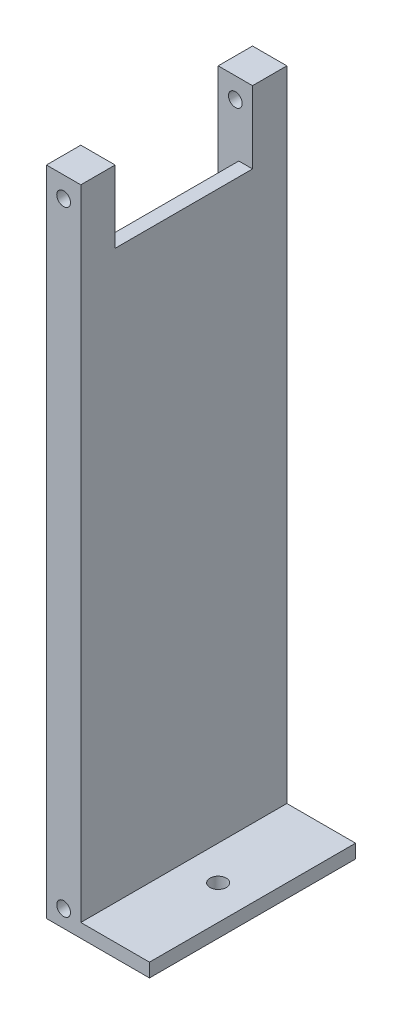
ISO-10303-21;
HEADER;
FILE_DESCRIPTION(('STEP AP214'),'2;1');
FILE_NAME('part.step','',(''),(''),'','','');
FILE_SCHEMA(('AUTOMOTIVE_DESIGN { 1 0 10303 214 1 1 1 1 }'));
ENDSEC;
DATA;
#1=APPLICATION_CONTEXT('core data for automotive mechanical design processes');
#2=APPLICATION_PROTOCOL_DEFINITION('international standard','automotive_design',2000,#1);
#3=PRODUCT_CONTEXT('',#1,'mechanical');
#4=PRODUCT('Part','Part','',(#3));
#5=PRODUCT_RELATED_PRODUCT_CATEGORY('part','',(#4));
#6=PRODUCT_DEFINITION_FORMATION('','',#4);
#7=PRODUCT_DEFINITION_CONTEXT('part definition',#1,'design');
#8=PRODUCT_DEFINITION('design','',#6,#7);
#9=PRODUCT_DEFINITION_SHAPE('','',#8);
#10=(LENGTH_UNIT() NAMED_UNIT(*) SI_UNIT(.MILLI.,.METRE.));
#11=(NAMED_UNIT(*) PLANE_ANGLE_UNIT() SI_UNIT($,.RADIAN.));
#12=(NAMED_UNIT(*) SI_UNIT($,.STERADIAN.) SOLID_ANGLE_UNIT());
#13=UNCERTAINTY_MEASURE_WITH_UNIT(LENGTH_MEASURE(1.E-05),#10,'distance_accuracy_value','');
#14=(GEOMETRIC_REPRESENTATION_CONTEXT(3) GLOBAL_UNCERTAINTY_ASSIGNED_CONTEXT((#13)) GLOBAL_UNIT_ASSIGNED_CONTEXT((#10,
#11,#12)) REPRESENTATION_CONTEXT('',''));
#15=CARTESIAN_POINT('',(0.,0.,0.));
#16=DIRECTION('',(0.,0.,1.));
#17=DIRECTION('',(1.,0.,0.));
#18=AXIS2_PLACEMENT_3D('',#15,#16,#17);
#19=CARTESIAN_POINT('',(5.,47.5,15.));
#20=DIRECTION('',(0.,-1.,0.));
#21=DIRECTION('',(0.,0.,-1.));
#22=AXIS2_PLACEMENT_3D('',#19,#20,#21);
#23=PLANE('',#22);
#24=DIRECTION('',(0.,0.,1.));
#25=VECTOR('',#24,1.);
#26=CARTESIAN_POINT('',(5.,47.5,15.));
#27=LINE('',#26,#25);
#28=CARTESIAN_POINT('',(5.,47.5,9.99999999999999));
#29=VERTEX_POINT('',#28);
#30=CARTESIAN_POINT('',(5.,47.5,15.));
#31=VERTEX_POINT('',#30);
#32=EDGE_CURVE('E222',#29,#31,#27,.T.);
#33=ORIENTED_EDGE('',*,*,#32,.F.);
#34=DIRECTION('',(-1.,0.,0.));
#35=VECTOR('',#34,1.);
#36=CARTESIAN_POINT('',(3.,47.5,9.99999999999999));
#37=LINE('',#36,#35);
#38=CARTESIAN_POINT('',(0.,47.5,9.99999999999999));
#39=VERTEX_POINT('',#38);
#40=EDGE_CURVE('E150',#29,#39,#37,.T.);
#41=ORIENTED_EDGE('',*,*,#40,.T.);
#42=DIRECTION('',(0.,0.,1.));
#43=VECTOR('',#42,1.);
#44=CARTESIAN_POINT('',(0.,47.5,15.));
#45=LINE('',#44,#43);
#46=CARTESIAN_POINT('',(0.,47.5,15.));
#47=VERTEX_POINT('',#46);
#48=EDGE_CURVE('E233',#39,#47,#45,.T.);
#49=ORIENTED_EDGE('',*,*,#48,.T.);
#50=DIRECTION('',(-1.,0.,0.));
#51=VECTOR('',#50,1.);
#52=CARTESIAN_POINT('',(5.,47.5,15.));
#53=LINE('',#52,#51);
#54=EDGE_CURVE('E209',#31,#47,#53,.T.);
#55=ORIENTED_EDGE('',*,*,#54,.F.);
#56=EDGE_LOOP('',(#33,#41,#49,#55));
#57=FACE_BOUND('',#56,.T.);
#58=ADVANCED_FACE('F33',(#57),#23,.F.);
#59=CARTESIAN_POINT('',(2.5,44.5,-15.));
#60=DIRECTION('',(0.,0.,-1.));
#61=DIRECTION('',(-1.,0.,0.));
#62=AXIS2_PLACEMENT_3D('',#59,#60,#61);
#63=CYLINDRICAL_SURFACE('',#62,0.999999999999994);
#64=CARTESIAN_POINT('',(2.5,44.5,15.));
#65=DIRECTION('',(0.,0.,-1.));
#66=DIRECTION('',(-1.,0.,0.));
#67=AXIS2_PLACEMENT_3D('',#64,#65,#66);
#68=CIRCLE('',#67,0.999999999999993);
#69=CARTESIAN_POINT('',(1.50000000000001,44.5,15.));
#70=VERTEX_POINT('',#69);
#71=EDGE_CURVE('E226',#70,#70,#68,.T.);
#72=ORIENTED_EDGE('',*,*,#71,.F.);
#73=EDGE_LOOP('',(#72));
#74=FACE_BOUND('',#73,.T.);
#75=CARTESIAN_POINT('',(2.5,44.5,9.99999999999999));
#76=DIRECTION('',(0.,0.,1.));
#77=DIRECTION('',(0.,-1.,0.));
#78=AXIS2_PLACEMENT_3D('',#75,#76,#77);
#79=CIRCLE('',#78,0.999999999999994);
#80=CARTESIAN_POINT('',(2.5,43.5,9.99999999999999));
#81=VERTEX_POINT('',#80);
#82=EDGE_CURVE('E11',#81,#81,#79,.F.);
#83=ORIENTED_EDGE('',*,*,#82,.T.);
#84=EDGE_LOOP('',(#83));
#85=FACE_BOUND('',#84,.T.);
#86=ADVANCED_FACE('F291',(#74,#85),#63,.F.);
#87=CARTESIAN_POINT('',(5.,0.,0.));
#88=DIRECTION('',(-1.,0.,0.));
#89=DIRECTION('',(0.,0.,1.));
#90=AXIS2_PLACEMENT_3D('',#87,#88,#89);
#91=PLANE('',#90);
#92=DIRECTION('',(0.,0.,1.));
#93=VECTOR('',#92,1.);
#94=CARTESIAN_POINT('',(5.,37.,0.));
#95=LINE('',#94,#93);
#96=CARTESIAN_POINT('',(5.,37.,-10.));
#97=VERTEX_POINT('',#96);
#98=CARTESIAN_POINT('',(5.,37.,10.));
#99=VERTEX_POINT('',#98);
#100=EDGE_CURVE('E130',#97,#99,#95,.T.);
#101=ORIENTED_EDGE('',*,*,#100,.T.);
#102=DIRECTION('',(0.,1.,0.));
#103=VECTOR('',#102,1.);
#104=CARTESIAN_POINT('',(5.,0.,10.));
#105=LINE('',#104,#103);
#106=EDGE_CURVE('E267',#99,#29,#105,.T.);
#107=ORIENTED_EDGE('',*,*,#106,.T.);
#108=ORIENTED_EDGE('',*,*,#32,.T.);
#109=DIRECTION('',(0.,-1.,0.));
#110=VECTOR('',#109,1.);
#111=CARTESIAN_POINT('',(5.,-47.5,15.));
#112=LINE('',#111,#110);
#113=CARTESIAN_POINT('',(5.,-45.5,15.));
#114=VERTEX_POINT('',#113);
#115=EDGE_CURVE('E193',#31,#114,#112,.T.);
#116=ORIENTED_EDGE('',*,*,#115,.T.);
#117=DIRECTION('',(0.,0.,1.));
#118=VECTOR('',#117,1.);
#119=CARTESIAN_POINT('',(5.,-45.5,-15.));
#120=LINE('',#119,#118);
#121=CARTESIAN_POINT('',(5.,-45.5,-15.));
#122=VERTEX_POINT('',#121);
#123=EDGE_CURVE('E56',#122,#114,#120,.T.);
#124=ORIENTED_EDGE('',*,*,#123,.F.);
#125=DIRECTION('',(0.,1.,0.));
#126=VECTOR('',#125,1.);
#127=CARTESIAN_POINT('',(5.,-47.5,-15.));
#128=LINE('',#127,#126);
#129=CARTESIAN_POINT('',(5.,47.5,-15.));
#130=VERTEX_POINT('',#129);
#131=EDGE_CURVE('E220',#122,#130,#128,.T.);
#132=ORIENTED_EDGE('',*,*,#131,.T.);
#133=CARTESIAN_POINT('',(5.,47.5,-10.));
#134=VERTEX_POINT('',#133);
#135=EDGE_CURVE('E227',#130,#134,#27,.T.);
#136=ORIENTED_EDGE('',*,*,#135,.T.);
#137=DIRECTION('',(0.,-1.,0.));
#138=VECTOR('',#137,1.);
#139=CARTESIAN_POINT('',(5.,0.,-10.));
#140=LINE('',#139,#138);
#141=EDGE_CURVE('E266',#134,#97,#140,.T.);
#142=ORIENTED_EDGE('',*,*,#141,.T.);
#143=EDGE_LOOP('',(#101,#107,#108,#116,#124,#132,#136,#142));
#144=FACE_BOUND('',#143,.T.);
#145=ADVANCED_FACE('F264',(#144),#91,.F.);
#146=CARTESIAN_POINT('',(5.,-47.5,-15.));
#147=DIRECTION('',(0.,0.,1.));
#148=DIRECTION('',(1.,0.,0.));
#149=AXIS2_PLACEMENT_3D('',#146,#147,#148);
#150=PLANE('',#149);
#151=CARTESIAN_POINT('',(2.5,-45.,-15.));
#152=DIRECTION('',(0.,0.,-1.));
#153=DIRECTION('',(-1.,0.,0.));
#154=AXIS2_PLACEMENT_3D('',#151,#152,#153);
#155=CIRCLE('',#154,0.999999999999997);
#156=CARTESIAN_POINT('',(1.5,-45.,-15.));
#157=VERTEX_POINT('',#156);
#158=EDGE_CURVE('E313',#157,#157,#155,.T.);
#159=ORIENTED_EDGE('',*,*,#158,.F.);
#160=EDGE_LOOP('',(#159));
#161=FACE_BOUND('',#160,.T.);
#162=CARTESIAN_POINT('',(2.5,44.5,-15.));
#163=DIRECTION('',(0.,0.,-1.));
#164=DIRECTION('',(-1.,0.,0.));
#165=AXIS2_PLACEMENT_3D('',#162,#163,#164);
#166=CIRCLE('',#165,0.999999999999996);
#167=CARTESIAN_POINT('',(1.5,44.5,-15.));
#168=VERTEX_POINT('',#167);
#169=EDGE_CURVE('E188',#168,#168,#166,.T.);
#170=ORIENTED_EDGE('',*,*,#169,.F.);
#171=EDGE_LOOP('',(#170));
#172=FACE_BOUND('',#171,.T.);
#173=DIRECTION('',(0.,1.,0.));
#174=VECTOR('',#173,1.);
#175=CARTESIAN_POINT('',(0.,-47.5,-15.));
#176=LINE('',#175,#174);
#177=CARTESIAN_POINT('',(0.,-47.5,-15.));
#178=VERTEX_POINT('',#177);
#179=CARTESIAN_POINT('',(0.,47.5,-15.));
#180=VERTEX_POINT('',#179);
#181=EDGE_CURVE('E231',#178,#180,#176,.T.);
#182=ORIENTED_EDGE('',*,*,#181,.T.);
#183=DIRECTION('',(-1.,0.,0.));
#184=VECTOR('',#183,1.);
#185=CARTESIAN_POINT('',(5.,47.5,-15.));
#186=LINE('',#185,#184);
#187=EDGE_CURVE('E205',#130,#180,#186,.T.);
#188=ORIENTED_EDGE('',*,*,#187,.F.);
#189=ORIENTED_EDGE('',*,*,#131,.F.);
#190=DIRECTION('',(-1.,0.,0.));
#191=VECTOR('',#190,1.);
#192=CARTESIAN_POINT('',(15.,-45.5,-15.));
#193=LINE('',#192,#191);
#194=CARTESIAN_POINT('',(15.,-45.5,-15.));
#195=VERTEX_POINT('',#194);
#196=EDGE_CURVE('E198',#195,#122,#193,.T.);
#197=ORIENTED_EDGE('',*,*,#196,.F.);
#198=DIRECTION('',(0.,1.,0.));
#199=VECTOR('',#198,1.);
#200=CARTESIAN_POINT('',(15.,-47.5,-15.));
#201=LINE('',#200,#199);
#202=CARTESIAN_POINT('',(15.,-47.5,-15.));
#203=VERTEX_POINT('',#202);
#204=EDGE_CURVE('E174',#203,#195,#201,.T.);
#205=ORIENTED_EDGE('',*,*,#204,.F.);
#206=DIRECTION('',(-1.,0.,0.));
#207=VECTOR('',#206,1.);
#208=CARTESIAN_POINT('',(5.,-47.5,-15.));
#209=LINE('',#208,#207);
#210=EDGE_CURVE('E239',#203,#178,#209,.T.);
#211=ORIENTED_EDGE('',*,*,#210,.T.);
#212=EDGE_LOOP('',(#182,#188,#189,#197,#205,#211));
#213=FACE_BOUND('',#212,.T.);
#214=ADVANCED_FACE('F35',(#161,#172,#213),#150,.F.);
#215=DIRECTION('',(-1.,0.,0.));
#216=VECTOR('',#215,1.);
#217=CARTESIAN_POINT('',(3.,47.5,-10.));
#218=LINE('',#217,#216);
#219=CARTESIAN_POINT('',(0.,47.5,-10.));
#220=VERTEX_POINT('',#219);
#221=EDGE_CURVE('E48',#134,#220,#218,.T.);
#222=ORIENTED_EDGE('',*,*,#221,.F.);
#223=ORIENTED_EDGE('',*,*,#135,.F.);
#224=ORIENTED_EDGE('',*,*,#187,.T.);
#225=EDGE_CURVE('E234',#180,#220,#45,.T.);
#226=ORIENTED_EDGE('',*,*,#225,.T.);
#227=EDGE_LOOP('',(#222,#223,#224,#226));
#228=FACE_BOUND('',#227,.T.);
#229=ADVANCED_FACE('F265',(#228),#23,.F.);
#230=CARTESIAN_POINT('',(5.,-47.5,15.));
#231=DIRECTION('',(0.,0.,-1.));
#232=DIRECTION('',(-1.,0.,0.));
#233=AXIS2_PLACEMENT_3D('',#230,#231,#232);
#234=PLANE('',#233);
#235=CARTESIAN_POINT('',(2.5,-45.,15.));
#236=DIRECTION('',(0.,0.,-1.));
#237=DIRECTION('',(-1.,0.,0.));
#238=AXIS2_PLACEMENT_3D('',#235,#236,#237);
#239=CIRCLE('',#238,0.999999999999995);
#240=CARTESIAN_POINT('',(1.50000000000001,-45.,15.));
#241=VERTEX_POINT('',#240);
#242=EDGE_CURVE('E142',#241,#241,#239,.T.);
#243=ORIENTED_EDGE('',*,*,#242,.T.);
#244=EDGE_LOOP('',(#243));
#245=FACE_BOUND('',#244,.T.);
#246=ORIENTED_EDGE('',*,*,#71,.T.);
#247=EDGE_LOOP('',(#246));
#248=FACE_BOUND('',#247,.T.);
#249=DIRECTION('',(0.,-1.,0.));
#250=VECTOR('',#249,1.);
#251=CARTESIAN_POINT('',(0.,-47.5,15.));
#252=LINE('',#251,#250);
#253=CARTESIAN_POINT('',(0.,-47.5,15.));
#254=VERTEX_POINT('',#253);
#255=EDGE_CURVE('E236',#47,#254,#252,.T.);
#256=ORIENTED_EDGE('',*,*,#255,.T.);
#257=DIRECTION('',(-1.,0.,0.));
#258=VECTOR('',#257,1.);
#259=CARTESIAN_POINT('',(5.,-47.5,15.));
#260=LINE('',#259,#258);
#261=CARTESIAN_POINT('',(15.,-47.5,15.));
#262=VERTEX_POINT('',#261);
#263=EDGE_CURVE('E217',#262,#254,#260,.T.);
#264=ORIENTED_EDGE('',*,*,#263,.F.);
#265=DIRECTION('',(0.,-1.,0.));
#266=VECTOR('',#265,1.);
#267=CARTESIAN_POINT('',(15.,-47.5,15.));
#268=LINE('',#267,#266);
#269=CARTESIAN_POINT('',(15.,-45.5,15.));
#270=VERTEX_POINT('',#269);
#271=EDGE_CURVE('E179',#270,#262,#268,.T.);
#272=ORIENTED_EDGE('',*,*,#271,.F.);
#273=DIRECTION('',(-1.,0.,0.));
#274=VECTOR('',#273,1.);
#275=CARTESIAN_POINT('',(15.,-45.5,15.));
#276=LINE('',#275,#274);
#277=EDGE_CURVE('E185',#270,#114,#276,.T.);
#278=ORIENTED_EDGE('',*,*,#277,.T.);
#279=ORIENTED_EDGE('',*,*,#115,.F.);
#280=ORIENTED_EDGE('',*,*,#54,.T.);
#281=EDGE_LOOP('',(#256,#264,#272,#278,#279,#280));
#282=FACE_BOUND('',#281,.T.);
#283=ADVANCED_FACE('F260',(#245,#248,#282),#234,.F.);
#284=CARTESIAN_POINT('',(5.,-47.5,15.));
#285=DIRECTION('',(0.,1.,0.));
#286=DIRECTION('',(0.,0.,1.));
#287=AXIS2_PLACEMENT_3D('',#284,#285,#286);
#288=PLANE('',#287);
#289=CARTESIAN_POINT('',(10.,-47.5,0.));
#290=DIRECTION('',(0.,1.,0.));
#291=DIRECTION('',(0.,0.,1.));
#292=AXIS2_PLACEMENT_3D('',#289,#290,#291);
#293=CIRCLE('',#292,1.190625);
#294=CARTESIAN_POINT('',(10.,-47.5,1.190625));
#295=VERTEX_POINT('',#294);
#296=EDGE_CURVE('E171',#295,#295,#293,.T.);
#297=ORIENTED_EDGE('',*,*,#296,.T.);
#298=EDGE_LOOP('',(#297));
#299=FACE_BOUND('',#298,.T.);
#300=DIRECTION('',(0.,0.,-1.));
#301=VECTOR('',#300,1.);
#302=CARTESIAN_POINT('',(0.,-47.5,15.));
#303=LINE('',#302,#301);
#304=EDGE_CURVE('E223',#254,#178,#303,.T.);
#305=ORIENTED_EDGE('',*,*,#304,.T.);
#306=ORIENTED_EDGE('',*,*,#210,.F.);
#307=DIRECTION('',(0.,0.,-1.));
#308=VECTOR('',#307,1.);
#309=CARTESIAN_POINT('',(15.,-47.5,-15.));
#310=LINE('',#309,#308);
#311=EDGE_CURVE('E182',#262,#203,#310,.T.);
#312=ORIENTED_EDGE('',*,*,#311,.F.);
#313=ORIENTED_EDGE('',*,*,#263,.T.);
#314=EDGE_LOOP('',(#305,#306,#312,#313));
#315=FACE_BOUND('',#314,.T.);
#316=ADVANCED_FACE('F245',(#299,#315),#288,.F.);
#317=CARTESIAN_POINT('',(0.,0.,0.));
#318=DIRECTION('',(-1.,0.,0.));
#319=DIRECTION('',(0.,0.,1.));
#320=AXIS2_PLACEMENT_3D('',#317,#318,#319);
#321=PLANE('',#320);
#322=DIRECTION('',(0.,1.,0.));
#323=VECTOR('',#322,1.);
#324=CARTESIAN_POINT('',(0.,47.5,9.99999999999999));
#325=LINE('',#324,#323);
#326=CARTESIAN_POINT('',(0.,32.5,10.));
#327=VERTEX_POINT('',#326);
#328=EDGE_CURVE('E156',#327,#39,#325,.T.);
#329=ORIENTED_EDGE('',*,*,#328,.F.);
#330=DIRECTION('',(0.,0.,1.));
#331=VECTOR('',#330,1.);
#332=CARTESIAN_POINT('',(0.,32.5,10.));
#333=LINE('',#332,#331);
#334=CARTESIAN_POINT('',(0.,32.5,-10.));
#335=VERTEX_POINT('',#334);
#336=EDGE_CURVE('E152',#335,#327,#333,.T.);
#337=ORIENTED_EDGE('',*,*,#336,.F.);
#338=DIRECTION('',(0.,-1.,0.));
#339=VECTOR('',#338,1.);
#340=CARTESIAN_POINT('',(0.,47.5,-10.));
#341=LINE('',#340,#339);
#342=EDGE_CURVE('E158',#220,#335,#341,.T.);
#343=ORIENTED_EDGE('',*,*,#342,.F.);
#344=ORIENTED_EDGE('',*,*,#225,.F.);
#345=ORIENTED_EDGE('',*,*,#181,.F.);
#346=ORIENTED_EDGE('',*,*,#304,.F.);
#347=ORIENTED_EDGE('',*,*,#255,.F.);
#348=ORIENTED_EDGE('',*,*,#48,.F.);
#349=EDGE_LOOP('',(#329,#337,#343,#344,#345,#346,#347,#348));
#350=FACE_BOUND('',#349,.T.);
#351=ADVANCED_FACE('F252',(#350),#321,.T.);
#352=CARTESIAN_POINT('',(2.5,44.5,-10.));
#353=DIRECTION('',(0.,0.,-1.));
#354=DIRECTION('',(0.,1.,0.));
#355=AXIS2_PLACEMENT_3D('',#352,#353,#354);
#356=CIRCLE('',#355,0.999999999999994);
#357=CARTESIAN_POINT('',(2.5,45.5,-10.));
#358=VERTEX_POINT('',#357);
#359=EDGE_CURVE('E41',#358,#358,#356,.F.);
#360=ORIENTED_EDGE('',*,*,#359,.T.);
#361=EDGE_LOOP('',(#360));
#362=FACE_BOUND('',#361,.T.);
#363=ORIENTED_EDGE('',*,*,#169,.T.);
#364=EDGE_LOOP('',(#363));
#365=FACE_BOUND('',#364,.T.);
#366=ADVANCED_FACE('F297',(#362,#365),#63,.F.);
#367=CARTESIAN_POINT('',(15.,-45.5,-15.));
#368=DIRECTION('',(0.,-1.,0.));
#369=DIRECTION('',(0.,0.,-1.));
#370=AXIS2_PLACEMENT_3D('',#367,#368,#369);
#371=PLANE('',#370);
#372=CARTESIAN_POINT('',(10.,-45.5,0.));
#373=DIRECTION('',(0.,1.,0.));
#374=DIRECTION('',(0.,0.,1.));
#375=AXIS2_PLACEMENT_3D('',#372,#373,#374);
#376=CIRCLE('',#375,1.19062499999999);
#377=CARTESIAN_POINT('',(10.,-45.5,1.19062499999999));
#378=VERTEX_POINT('',#377);
#379=EDGE_CURVE('E164',#378,#378,#376,.T.);
#380=ORIENTED_EDGE('',*,*,#379,.F.);
#381=EDGE_LOOP('',(#380));
#382=FACE_BOUND('',#381,.T.);
#383=ORIENTED_EDGE('',*,*,#123,.T.);
#384=ORIENTED_EDGE('',*,*,#277,.F.);
#385=DIRECTION('',(0.,0.,1.));
#386=VECTOR('',#385,1.);
#387=CARTESIAN_POINT('',(15.,-45.5,-15.));
#388=LINE('',#387,#386);
#389=EDGE_CURVE('E177',#195,#270,#388,.T.);
#390=ORIENTED_EDGE('',*,*,#389,.F.);
#391=ORIENTED_EDGE('',*,*,#196,.T.);
#392=EDGE_LOOP('',(#383,#384,#390,#391));
#393=FACE_BOUND('',#392,.T.);
#394=ADVANCED_FACE('F263',(#382,#393),#371,.F.);
#395=CARTESIAN_POINT('',(15.,0.,0.));
#396=DIRECTION('',(1.,0.,0.));
#397=DIRECTION('',(0.,0.,-1.));
#398=AXIS2_PLACEMENT_3D('',#395,#396,#397);
#399=PLANE('',#398);
#400=ORIENTED_EDGE('',*,*,#204,.T.);
#401=ORIENTED_EDGE('',*,*,#389,.T.);
#402=ORIENTED_EDGE('',*,*,#271,.T.);
#403=ORIENTED_EDGE('',*,*,#311,.T.);
#404=EDGE_LOOP('',(#400,#401,#402,#403));
#405=FACE_BOUND('',#404,.T.);
#406=ADVANCED_FACE('F258',(#405),#399,.T.);
#407=CARTESIAN_POINT('',(10.,-45.5,0.));
#408=DIRECTION('',(0.,1.,0.));
#409=DIRECTION('',(0.,0.,1.));
#410=AXIS2_PLACEMENT_3D('',#407,#408,#409);
#411=CYLINDRICAL_SURFACE('',#410,1.19062499999999);
#412=ORIENTED_EDGE('',*,*,#296,.F.);
#413=EDGE_LOOP('',(#412));
#414=FACE_BOUND('',#413,.T.);
#415=ORIENTED_EDGE('',*,*,#379,.T.);
#416=EDGE_LOOP('',(#415));
#417=FACE_BOUND('',#416,.T.);
#418=ADVANCED_FACE('F324',(#414,#417),#411,.F.);
#419=CARTESIAN_POINT('',(3.,47.5,9.99999999999999));
#420=DIRECTION('',(0.,0.,1.));
#421=DIRECTION('',(0.,-1.,0.));
#422=AXIS2_PLACEMENT_3D('',#419,#420,#421);
#423=PLANE('',#422);
#424=ORIENTED_EDGE('',*,*,#82,.F.);
#425=EDGE_LOOP('',(#424));
#426=FACE_BOUND('',#425,.T.);
#427=DIRECTION('',(0.,1.,0.));
#428=VECTOR('',#427,1.);
#429=CARTESIAN_POINT('',(3.,47.5,9.99999999999999));
#430=LINE('',#429,#428);
#431=CARTESIAN_POINT('',(3.,32.5,10.));
#432=VERTEX_POINT('',#431);
#433=CARTESIAN_POINT('',(3.,37.,10.));
#434=VERTEX_POINT('',#433);
#435=EDGE_CURVE('E141',#432,#434,#430,.T.);
#436=ORIENTED_EDGE('',*,*,#435,.F.);
#437=DIRECTION('',(-1.,0.,0.));
#438=VECTOR('',#437,1.);
#439=CARTESIAN_POINT('',(3.,32.5,10.));
#440=LINE('',#439,#438);
#441=EDGE_CURVE('E162',#432,#327,#440,.T.);
#442=ORIENTED_EDGE('',*,*,#441,.T.);
#443=ORIENTED_EDGE('',*,*,#328,.T.);
#444=ORIENTED_EDGE('',*,*,#40,.F.);
#445=ORIENTED_EDGE('',*,*,#106,.F.);
#446=DIRECTION('',(-1.,0.,0.));
#447=VECTOR('',#446,1.);
#448=CARTESIAN_POINT('',(15.000025,37.,10.));
#449=LINE('',#448,#447);
#450=EDGE_CURVE('E133',#99,#434,#449,.T.);
#451=ORIENTED_EDGE('',*,*,#450,.T.);
#452=EDGE_LOOP('',(#436,#442,#443,#444,#445,#451));
#453=FACE_BOUND('',#452,.T.);
#454=ADVANCED_FACE('F277',(#426,#453),#423,.F.);
#455=CARTESIAN_POINT('',(3.,47.5,-10.));
#456=DIRECTION('',(0.,0.,-1.));
#457=DIRECTION('',(0.,1.,0.));
#458=AXIS2_PLACEMENT_3D('',#455,#456,#457);
#459=PLANE('',#458);
#460=DIRECTION('',(0.,-1.,0.));
#461=VECTOR('',#460,1.);
#462=CARTESIAN_POINT('',(3.,47.5,-10.));
#463=LINE('',#462,#461);
#464=CARTESIAN_POINT('',(3.,37.,-10.));
#465=VERTEX_POINT('',#464);
#466=CARTESIAN_POINT('',(3.,32.5,-10.));
#467=VERTEX_POINT('',#466);
#468=EDGE_CURVE('E138',#465,#467,#463,.T.);
#469=ORIENTED_EDGE('',*,*,#468,.F.);
#470=DIRECTION('',(-1.,0.,0.));
#471=VECTOR('',#470,1.);
#472=CARTESIAN_POINT('',(15.000025,37.,-10.));
#473=LINE('',#472,#471);
#474=EDGE_CURVE('E123',#97,#465,#473,.T.);
#475=ORIENTED_EDGE('',*,*,#474,.F.);
#476=ORIENTED_EDGE('',*,*,#141,.F.);
#477=ORIENTED_EDGE('',*,*,#221,.T.);
#478=ORIENTED_EDGE('',*,*,#342,.T.);
#479=DIRECTION('',(-1.,0.,0.));
#480=VECTOR('',#479,1.);
#481=CARTESIAN_POINT('',(3.,32.5,-10.));
#482=LINE('',#481,#480);
#483=EDGE_CURVE('E146',#467,#335,#482,.T.);
#484=ORIENTED_EDGE('',*,*,#483,.F.);
#485=EDGE_LOOP('',(#469,#475,#476,#477,#478,#484));
#486=FACE_BOUND('',#485,.T.);
#487=ORIENTED_EDGE('',*,*,#359,.F.);
#488=EDGE_LOOP('',(#487));
#489=FACE_BOUND('',#488,.T.);
#490=ADVANCED_FACE('F144',(#486,#489),#459,.F.);
#491=CARTESIAN_POINT('',(3.,0.,0.));
#492=DIRECTION('',(1.,0.,0.));
#493=DIRECTION('',(0.,0.,-1.));
#494=AXIS2_PLACEMENT_3D('',#491,#492,#493);
#495=PLANE('',#494);
#496=ORIENTED_EDGE('',*,*,#435,.T.);
#497=DIRECTION('',(0.,0.,1.));
#498=VECTOR('',#497,1.);
#499=CARTESIAN_POINT('',(3.,37.,10.));
#500=LINE('',#499,#498);
#501=EDGE_CURVE('E127',#465,#434,#500,.T.);
#502=ORIENTED_EDGE('',*,*,#501,.F.);
#503=ORIENTED_EDGE('',*,*,#468,.T.);
#504=DIRECTION('',(0.,0.,1.));
#505=VECTOR('',#504,1.);
#506=CARTESIAN_POINT('',(3.,32.5,10.));
#507=LINE('',#506,#505);
#508=EDGE_CURVE('E148',#467,#432,#507,.T.);
#509=ORIENTED_EDGE('',*,*,#508,.T.);
#510=EDGE_LOOP('',(#496,#502,#503,#509));
#511=FACE_BOUND('',#510,.T.);
#512=ADVANCED_FACE('F136',(#511),#495,.F.);
#513=CARTESIAN_POINT('',(3.,32.5,10.));
#514=DIRECTION('',(0.,-1.,0.));
#515=DIRECTION('',(0.,0.,-1.));
#516=AXIS2_PLACEMENT_3D('',#513,#514,#515);
#517=PLANE('',#516);
#518=ORIENTED_EDGE('',*,*,#336,.T.);
#519=ORIENTED_EDGE('',*,*,#441,.F.);
#520=ORIENTED_EDGE('',*,*,#508,.F.);
#521=ORIENTED_EDGE('',*,*,#483,.T.);
#522=EDGE_LOOP('',(#518,#519,#520,#521));
#523=FACE_BOUND('',#522,.T.);
#524=ADVANCED_FACE('F279',(#523),#517,.F.);
#525=CARTESIAN_POINT('',(15.000025,37.,10.));
#526=DIRECTION('',(0.,-1.,0.));
#527=DIRECTION('',(0.,0.,-1.));
#528=AXIS2_PLACEMENT_3D('',#525,#526,#527);
#529=PLANE('',#528);
#530=ORIENTED_EDGE('',*,*,#474,.T.);
#531=ORIENTED_EDGE('',*,*,#501,.T.);
#532=ORIENTED_EDGE('',*,*,#450,.F.);
#533=ORIENTED_EDGE('',*,*,#100,.F.);
#534=EDGE_LOOP('',(#530,#531,#532,#533));
#535=FACE_BOUND('',#534,.T.);
#536=ADVANCED_FACE('F125',(#535),#529,.F.);
#537=CARTESIAN_POINT('',(2.5,-45.,-15.));
#538=DIRECTION('',(0.,0.,-1.));
#539=DIRECTION('',(-1.,0.,0.));
#540=AXIS2_PLACEMENT_3D('',#537,#538,#539);
#541=CYLINDRICAL_SURFACE('',#540,0.999999999999995);
#542=ORIENTED_EDGE('',*,*,#158,.T.);
#543=EDGE_LOOP('',(#542));
#544=FACE_BOUND('',#543,.T.);
#545=ORIENTED_EDGE('',*,*,#242,.F.);
#546=EDGE_LOOP('',(#545));
#547=FACE_BOUND('',#546,.T.);
#548=ADVANCED_FACE('F286',(#544,#547),#541,.F.);
#549=CLOSED_SHELL('',(#58,#86,#145,#214,#229,#283,#316,#351,#366,#394,#406,#418,#454,#490,#512,
#524,#536,#548));
#550=MANIFOLD_SOLID_BREP('B2',#549);
#551=ADVANCED_BREP_SHAPE_REPRESENTATION('',(#18,#550),#14);
#552=SHAPE_DEFINITION_REPRESENTATION(#9,#551);
ENDSEC;
END-ISO-10303-21;
